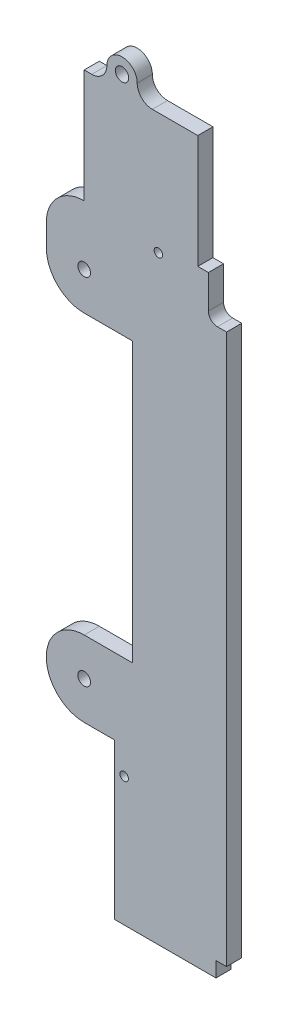
ISO-10303-21;
HEADER;
FILE_DESCRIPTION(('STEP AP214'),'2;1');
FILE_NAME('part.step','',(''),(''),'','','');
FILE_SCHEMA(('AUTOMOTIVE_DESIGN { 1 0 10303 214 1 1 1 1 }'));
ENDSEC;
DATA;
#1=APPLICATION_CONTEXT('core data for automotive mechanical design processes');
#2=APPLICATION_PROTOCOL_DEFINITION('international standard','automotive_design',2000,#1);
#3=PRODUCT_CONTEXT('',#1,'mechanical');
#4=PRODUCT('Part','Part','',(#3));
#5=PRODUCT_RELATED_PRODUCT_CATEGORY('part','',(#4));
#6=PRODUCT_DEFINITION_FORMATION('','',#4);
#7=PRODUCT_DEFINITION_CONTEXT('part definition',#1,'design');
#8=PRODUCT_DEFINITION('design','',#6,#7);
#9=PRODUCT_DEFINITION_SHAPE('','',#8);
#10=(LENGTH_UNIT() NAMED_UNIT(*) SI_UNIT(.MILLI.,.METRE.));
#11=(NAMED_UNIT(*) PLANE_ANGLE_UNIT() SI_UNIT($,.RADIAN.));
#12=(NAMED_UNIT(*) SI_UNIT($,.STERADIAN.) SOLID_ANGLE_UNIT());
#13=UNCERTAINTY_MEASURE_WITH_UNIT(LENGTH_MEASURE(1.E-05),#10,'distance_accuracy_value','');
#14=(GEOMETRIC_REPRESENTATION_CONTEXT(3) GLOBAL_UNCERTAINTY_ASSIGNED_CONTEXT((#13)) GLOBAL_UNIT_ASSIGNED_CONTEXT((#10,
#11,#12)) REPRESENTATION_CONTEXT('',''));
#15=CARTESIAN_POINT('',(0.,0.,0.));
#16=DIRECTION('',(0.,0.,1.));
#17=DIRECTION('',(1.,0.,0.));
#18=AXIS2_PLACEMENT_3D('',#15,#16,#17);
#19=CARTESIAN_POINT('',(44.,125.6,5.));
#20=DIRECTION('',(0.,0.,1.));
#21=DIRECTION('',(1.,0.,0.));
#22=AXIS2_PLACEMENT_3D('',#19,#20,#21);
#23=PLANE('',#22);
#24=CARTESIAN_POINT('',(24.5,134.,5.));
#25=DIRECTION('',(0.,0.,1.));
#26=DIRECTION('',(1.,0.,0.));
#27=AXIS2_PLACEMENT_3D('',#24,#25,#26);
#28=CIRCLE('',#27,1.40000000000001);
#29=CARTESIAN_POINT('',(25.9,134.,5.));
#30=VERTEX_POINT('',#29);
#31=EDGE_CURVE('E447',#30,#30,#28,.T.);
#32=ORIENTED_EDGE('',*,*,#31,.F.);
#33=EDGE_LOOP('',(#32));
#34=FACE_BOUND('',#33,.T.);
#35=CARTESIAN_POINT('',(13.2,-21.3,5.));
#36=DIRECTION('',(0.,0.,1.));
#37=DIRECTION('',(1.,0.,0.));
#38=AXIS2_PLACEMENT_3D('',#35,#36,#37);
#39=CIRCLE('',#38,1.4);
#40=CARTESIAN_POINT('',(14.6,-21.3,5.));
#41=VERTEX_POINT('',#40);
#42=EDGE_CURVE('E449',#41,#41,#39,.T.);
#43=ORIENTED_EDGE('',*,*,#42,.F.);
#44=EDGE_LOOP('',(#43));
#45=FACE_BOUND('',#44,.T.);
#46=CARTESIAN_POINT('',(0.,117.,5.));
#47=DIRECTION('',(0.,0.,1.));
#48=DIRECTION('',(1.,0.,0.));
#49=AXIS2_PLACEMENT_3D('',#46,#47,#48);
#50=CIRCLE('',#49,2.1);
#51=CARTESIAN_POINT('',(2.1,117.,5.));
#52=VERTEX_POINT('',#51);
#53=EDGE_CURVE('E464',#52,#52,#50,.T.);
#54=ORIENTED_EDGE('',*,*,#53,.F.);
#55=EDGE_LOOP('',(#54));
#56=FACE_BOUND('',#55,.T.);
#57=DIRECTION('',(1.,0.,0.));
#58=VECTOR('',#57,1.);
#59=CARTESIAN_POINT('',(43.5,-58.8,5.));
#60=LINE('',#59,#58);
#61=CARTESIAN_POINT('',(43.5,-58.8,5.));
#62=VERTEX_POINT('',#61);
#63=CARTESIAN_POINT('',(47.,-58.8,5.));
#64=VERTEX_POINT('',#63);
#65=EDGE_CURVE('E274',#62,#64,#60,.T.);
#66=ORIENTED_EDGE('',*,*,#65,.T.);
#67=DIRECTION('',(0.,1.,0.));
#68=VECTOR('',#67,1.);
#69=CARTESIAN_POINT('',(47.,-29.8,5.));
#70=LINE('',#69,#68);
#71=CARTESIAN_POINT('',(47.,122.6,5.));
#72=VERTEX_POINT('',#71);
#73=EDGE_CURVE('E142',#64,#72,#70,.T.);
#74=ORIENTED_EDGE('',*,*,#73,.T.);
#75=DIRECTION('',(-1.,0.,0.));
#76=VECTOR('',#75,1.);
#77=CARTESIAN_POINT('',(44.,122.6,5.));
#78=LINE('',#77,#76);
#79=CARTESIAN_POINT('',(44.,122.6,5.));
#80=VERTEX_POINT('',#79);
#81=EDGE_CURVE('E337',#72,#80,#78,.T.);
#82=ORIENTED_EDGE('',*,*,#81,.T.);
#83=CARTESIAN_POINT('',(44.,125.6,5.));
#84=DIRECTION('',(0.,0.,-1.));
#85=DIRECTION('',(1.,0.,0.));
#86=AXIS2_PLACEMENT_3D('',#83,#84,#85);
#87=CIRCLE('',#86,3.);
#88=CARTESIAN_POINT('',(41.,125.6,5.));
#89=VERTEX_POINT('',#88);
#90=EDGE_CURVE('E356',#80,#89,#87,.T.);
#91=ORIENTED_EDGE('',*,*,#90,.T.);
#92=DIRECTION('',(0.,1.,0.));
#93=VECTOR('',#92,1.);
#94=CARTESIAN_POINT('',(41.,136.6,5.));
#95=LINE('',#94,#93);
#96=CARTESIAN_POINT('',(41.,136.6,5.));
#97=VERTEX_POINT('',#96);
#98=EDGE_CURVE('E353',#89,#97,#95,.T.);
#99=ORIENTED_EDGE('',*,*,#98,.T.);
#100=DIRECTION('',(-1.,0.,0.));
#101=VECTOR('',#100,1.);
#102=CARTESIAN_POINT('',(41.,136.6,5.));
#103=LINE('',#102,#101);
#104=CARTESIAN_POINT('',(37.5,136.6,5.));
#105=VERTEX_POINT('',#104);
#106=EDGE_CURVE('E355',#97,#105,#103,.T.);
#107=ORIENTED_EDGE('',*,*,#106,.T.);
#108=DIRECTION('',(0.,1.,0.));
#109=VECTOR('',#108,1.);
#110=CARTESIAN_POINT('',(37.5,136.6,5.));
#111=LINE('',#110,#109);
#112=CARTESIAN_POINT('',(37.5,174.,5.));
#113=VERTEX_POINT('',#112);
#114=EDGE_CURVE('E358',#105,#113,#111,.T.);
#115=ORIENTED_EDGE('',*,*,#114,.T.);
#116=DIRECTION('',(-1.,0.,0.));
#117=VECTOR('',#116,1.);
#118=CARTESIAN_POINT('',(22.5,174.,5.));
#119=LINE('',#118,#117);
#120=CARTESIAN_POINT('',(22.5,174.,5.));
#121=VERTEX_POINT('',#120);
#122=EDGE_CURVE('E364',#113,#121,#119,.T.);
#123=ORIENTED_EDGE('',*,*,#122,.T.);
#124=CARTESIAN_POINT('',(22.5,179.,5.));
#125=DIRECTION('',(0.,0.,-1.));
#126=DIRECTION('',(1.,0.,0.));
#127=AXIS2_PLACEMENT_3D('',#124,#125,#126);
#128=CIRCLE('',#127,4.99999999999998);
#129=CARTESIAN_POINT('',(17.5,179.,5.));
#130=VERTEX_POINT('',#129);
#131=EDGE_CURVE('E366',#121,#130,#128,.T.);
#132=ORIENTED_EDGE('',*,*,#131,.T.);
#133=CARTESIAN_POINT('',(12.5,179.,5.));
#134=DIRECTION('',(0.,0.,1.));
#135=DIRECTION('',(1.,0.,0.));
#136=AXIS2_PLACEMENT_3D('',#133,#134,#135);
#137=CIRCLE('',#136,5.00000000000003);
#138=CARTESIAN_POINT('',(7.49999999999994,179.,5.));
#139=VERTEX_POINT('',#138);
#140=EDGE_CURVE('E368',#130,#139,#137,.T.);
#141=ORIENTED_EDGE('',*,*,#140,.T.);
#142=CARTESIAN_POINT('',(2.49999999999997,179.,5.));
#143=DIRECTION('',(0.,0.,-1.));
#144=DIRECTION('',(1.,0.,0.));
#145=AXIS2_PLACEMENT_3D('',#142,#143,#144);
#146=CIRCLE('',#145,4.99999999999999);
#147=CARTESIAN_POINT('',(2.49999999999997,174.,5.));
#148=VERTEX_POINT('',#147);
#149=EDGE_CURVE('E370',#139,#148,#146,.T.);
#150=ORIENTED_EDGE('',*,*,#149,.T.);
#151=DIRECTION('',(-1.,0.,0.));
#152=VECTOR('',#151,1.);
#153=CARTESIAN_POINT('',(0.,174.,5.));
#154=LINE('',#153,#152);
#155=CARTESIAN_POINT('',(0.,174.,5.));
#156=VERTEX_POINT('',#155);
#157=EDGE_CURVE('E372',#148,#156,#154,.T.);
#158=ORIENTED_EDGE('',*,*,#157,.T.);
#159=DIRECTION('',(0.,-1.,0.));
#160=VECTOR('',#159,1.);
#161=CARTESIAN_POINT('',(0.,136.6,5.));
#162=LINE('',#161,#160);
#163=CARTESIAN_POINT('',(0.,136.6,5.));
#164=VERTEX_POINT('',#163);
#165=EDGE_CURVE('E374',#156,#164,#162,.T.);
#166=ORIENTED_EDGE('',*,*,#165,.T.);
#167=CARTESIAN_POINT('',(0.,124.1,5.));
#168=DIRECTION('',(0.,0.,1.));
#169=DIRECTION('',(1.,0.,0.));
#170=AXIS2_PLACEMENT_3D('',#167,#168,#169);
#171=CIRCLE('',#170,12.5);
#172=CARTESIAN_POINT('',(-12.5,124.1,5.));
#173=VERTEX_POINT('',#172);
#174=EDGE_CURVE('E376',#164,#173,#171,.T.);
#175=ORIENTED_EDGE('',*,*,#174,.T.);
#176=DIRECTION('',(0.,-1.,0.));
#177=VECTOR('',#176,1.);
#178=CARTESIAN_POINT('',(-12.5,124.1,5.));
#179=LINE('',#178,#177);
#180=CARTESIAN_POINT('',(-12.5,117.,5.));
#181=VERTEX_POINT('',#180);
#182=EDGE_CURVE('E378',#173,#181,#179,.T.);
#183=ORIENTED_EDGE('',*,*,#182,.T.);
#184=CARTESIAN_POINT('',(0.,117.,5.));
#185=DIRECTION('',(0.,0.,1.));
#186=DIRECTION('',(1.,0.,0.));
#187=AXIS2_PLACEMENT_3D('',#184,#185,#186);
#188=CIRCLE('',#187,12.5);
#189=CARTESIAN_POINT('',(0.,104.5,5.));
#190=VERTEX_POINT('',#189);
#191=EDGE_CURVE('E380',#181,#190,#188,.T.);
#192=ORIENTED_EDGE('',*,*,#191,.T.);
#193=DIRECTION('',(1.,0.,0.));
#194=VECTOR('',#193,1.);
#195=CARTESIAN_POINT('',(16.,104.5,5.));
#196=LINE('',#195,#194);
#197=CARTESIAN_POINT('',(16.,104.5,5.));
#198=VERTEX_POINT('',#197);
#199=EDGE_CURVE('E382',#190,#198,#196,.T.);
#200=ORIENTED_EDGE('',*,*,#199,.T.);
#201=DIRECTION('',(0.,-1.,0.));
#202=VECTOR('',#201,1.);
#203=CARTESIAN_POINT('',(16.,12.5,5.));
#204=LINE('',#203,#202);
#205=CARTESIAN_POINT('',(16.,12.5,5.));
#206=VERTEX_POINT('',#205);
#207=EDGE_CURVE('E384',#198,#206,#204,.T.);
#208=ORIENTED_EDGE('',*,*,#207,.T.);
#209=DIRECTION('',(-1.,0.,0.));
#210=VECTOR('',#209,1.);
#211=CARTESIAN_POINT('',(0.,12.5,5.));
#212=LINE('',#211,#210);
#213=CARTESIAN_POINT('',(0.,12.5,5.));
#214=VERTEX_POINT('',#213);
#215=EDGE_CURVE('E386',#206,#214,#212,.T.);
#216=ORIENTED_EDGE('',*,*,#215,.T.);
#217=CARTESIAN_POINT('',(0.,0.,5.));
#218=DIRECTION('',(0.,0.,1.));
#219=DIRECTION('',(1.,0.,0.));
#220=AXIS2_PLACEMENT_3D('',#217,#218,#219);
#221=CIRCLE('',#220,12.5);
#222=CARTESIAN_POINT('',(0.,-12.5,5.));
#223=VERTEX_POINT('',#222);
#224=EDGE_CURVE('E388',#214,#223,#221,.T.);
#225=ORIENTED_EDGE('',*,*,#224,.T.);
#226=DIRECTION('',(1.,0.,0.));
#227=VECTOR('',#226,1.);
#228=CARTESIAN_POINT('',(0.,-12.5,5.));
#229=LINE('',#228,#227);
#230=CARTESIAN_POINT('',(10.,-12.5,5.));
#231=VERTEX_POINT('',#230);
#232=EDGE_CURVE('E209',#223,#231,#229,.T.);
#233=ORIENTED_EDGE('',*,*,#232,.T.);
#234=DIRECTION('',(0.,-1.,0.));
#235=VECTOR('',#234,1.);
#236=CARTESIAN_POINT('',(10.,-12.5,5.));
#237=LINE('',#236,#235);
#238=CARTESIAN_POINT('',(10.,-63.8,5.));
#239=VERTEX_POINT('',#238);
#240=EDGE_CURVE('E203',#231,#239,#237,.T.);
#241=ORIENTED_EDGE('',*,*,#240,.T.);
#242=DIRECTION('',(1.,0.,0.));
#243=VECTOR('',#242,1.);
#244=CARTESIAN_POINT('',(43.5,-63.8,5.));
#245=LINE('',#244,#243);
#246=CARTESIAN_POINT('',(43.5,-63.8,5.));
#247=VERTEX_POINT('',#246);
#248=EDGE_CURVE('E207',#239,#247,#245,.T.);
#249=ORIENTED_EDGE('',*,*,#248,.T.);
#250=DIRECTION('',(0.,1.,0.));
#251=VECTOR('',#250,1.);
#252=CARTESIAN_POINT('',(43.5,-58.8,5.));
#253=LINE('',#252,#251);
#254=EDGE_CURVE('E51',#247,#62,#253,.T.);
#255=ORIENTED_EDGE('',*,*,#254,.T.);
#256=EDGE_LOOP('',(#66,#74,#82,#91,#99,#107,#115,#123,#132,#141,#150,#158,#166,#175,#183,#192,
#200,#208,#216,#225,#233,#241,#249,#255));
#257=FACE_BOUND('',#256,.T.);
#258=CARTESIAN_POINT('',(0.,0.,5.));
#259=DIRECTION('',(0.,0.,1.));
#260=DIRECTION('',(1.,0.,0.));
#261=AXIS2_PLACEMENT_3D('',#258,#259,#260);
#262=CIRCLE('',#261,2.1);
#263=CARTESIAN_POINT('',(2.1,0.,5.));
#264=VERTEX_POINT('',#263);
#265=EDGE_CURVE('E230',#264,#264,#262,.T.);
#266=ORIENTED_EDGE('',*,*,#265,.F.);
#267=EDGE_LOOP('',(#266));
#268=FACE_BOUND('',#267,.T.);
#269=CARTESIAN_POINT('',(12.5,179.,5.));
#270=DIRECTION('',(0.,0.,1.));
#271=DIRECTION('',(1.,0.,0.));
#272=AXIS2_PLACEMENT_3D('',#269,#270,#271);
#273=CIRCLE('',#272,2.2);
#274=CARTESIAN_POINT('',(14.7,179.,5.));
#275=VERTEX_POINT('',#274);
#276=EDGE_CURVE('E458',#275,#275,#273,.T.);
#277=ORIENTED_EDGE('',*,*,#276,.F.);
#278=EDGE_LOOP('',(#277));
#279=FACE_BOUND('',#278,.T.);
#280=ADVANCED_FACE('F34',(#34,#45,#56,#257,#268,#279),#23,.T.);
#281=CARTESIAN_POINT('',(44.,125.6,0.));
#282=DIRECTION('',(0.,0.,1.));
#283=DIRECTION('',(1.,0.,0.));
#284=AXIS2_PLACEMENT_3D('',#281,#282,#283);
#285=PLANE('',#284);
#286=CARTESIAN_POINT('',(24.5,134.,0.));
#287=DIRECTION('',(0.,0.,1.));
#288=DIRECTION('',(1.,0.,0.));
#289=AXIS2_PLACEMENT_3D('',#286,#287,#288);
#290=CIRCLE('',#289,1.40000000000001);
#291=CARTESIAN_POINT('',(25.9,134.,0.));
#292=VERTEX_POINT('',#291);
#293=EDGE_CURVE('E445',#292,#292,#290,.T.);
#294=ORIENTED_EDGE('',*,*,#293,.T.);
#295=EDGE_LOOP('',(#294));
#296=FACE_BOUND('',#295,.T.);
#297=CARTESIAN_POINT('',(13.2,-21.3,0.));
#298=DIRECTION('',(0.,0.,1.));
#299=DIRECTION('',(1.,0.,0.));
#300=AXIS2_PLACEMENT_3D('',#297,#298,#299);
#301=CIRCLE('',#300,1.4);
#302=CARTESIAN_POINT('',(14.6,-21.3,0.));
#303=VERTEX_POINT('',#302);
#304=EDGE_CURVE('E452',#303,#303,#301,.T.);
#305=ORIENTED_EDGE('',*,*,#304,.T.);
#306=EDGE_LOOP('',(#305));
#307=FACE_BOUND('',#306,.T.);
#308=CARTESIAN_POINT('',(0.,117.,0.));
#309=DIRECTION('',(0.,0.,1.));
#310=DIRECTION('',(1.,0.,0.));
#311=AXIS2_PLACEMENT_3D('',#308,#309,#310);
#312=CIRCLE('',#311,2.1);
#313=CARTESIAN_POINT('',(2.1,117.,0.));
#314=VERTEX_POINT('',#313);
#315=EDGE_CURVE('E461',#314,#314,#312,.T.);
#316=ORIENTED_EDGE('',*,*,#315,.T.);
#317=EDGE_LOOP('',(#316));
#318=FACE_BOUND('',#317,.T.);
#319=DIRECTION('',(1.,0.,0.));
#320=VECTOR('',#319,1.);
#321=CARTESIAN_POINT('',(43.5,-58.8,0.));
#322=LINE('',#321,#320);
#323=CARTESIAN_POINT('',(43.5,-58.8,0.));
#324=VERTEX_POINT('',#323);
#325=CARTESIAN_POINT('',(47.,-58.8,0.));
#326=VERTEX_POINT('',#325);
#327=EDGE_CURVE('E226',#324,#326,#322,.T.);
#328=ORIENTED_EDGE('',*,*,#327,.F.);
#329=DIRECTION('',(0.,1.,0.));
#330=VECTOR('',#329,1.);
#331=CARTESIAN_POINT('',(43.5,-58.8,0.));
#332=LINE('',#331,#330);
#333=CARTESIAN_POINT('',(43.5,-63.8,0.));
#334=VERTEX_POINT('',#333);
#335=EDGE_CURVE('E134',#334,#324,#332,.T.);
#336=ORIENTED_EDGE('',*,*,#335,.F.);
#337=DIRECTION('',(1.,0.,0.));
#338=VECTOR('',#337,1.);
#339=CARTESIAN_POINT('',(43.5,-63.8,0.));
#340=LINE('',#339,#338);
#341=CARTESIAN_POINT('',(10.,-63.8,0.));
#342=VERTEX_POINT('',#341);
#343=EDGE_CURVE('E128',#342,#334,#340,.T.);
#344=ORIENTED_EDGE('',*,*,#343,.F.);
#345=DIRECTION('',(0.,-1.,0.));
#346=VECTOR('',#345,1.);
#347=CARTESIAN_POINT('',(10.,-63.8,0.));
#348=LINE('',#347,#346);
#349=CARTESIAN_POINT('',(10.,-12.5,0.));
#350=VERTEX_POINT('',#349);
#351=EDGE_CURVE('E216',#350,#342,#348,.T.);
#352=ORIENTED_EDGE('',*,*,#351,.F.);
#353=DIRECTION('',(1.,0.,0.));
#354=VECTOR('',#353,1.);
#355=CARTESIAN_POINT('',(0.,-12.5,0.));
#356=LINE('',#355,#354);
#357=CARTESIAN_POINT('',(0.,-12.5,0.));
#358=VERTEX_POINT('',#357);
#359=EDGE_CURVE('E268',#358,#350,#356,.T.);
#360=ORIENTED_EDGE('',*,*,#359,.F.);
#361=CARTESIAN_POINT('',(0.,0.,0.));
#362=DIRECTION('',(0.,0.,1.));
#363=DIRECTION('',(1.,0.,0.));
#364=AXIS2_PLACEMENT_3D('',#361,#362,#363);
#365=CIRCLE('',#364,12.5);
#366=CARTESIAN_POINT('',(0.,12.5,0.));
#367=VERTEX_POINT('',#366);
#368=EDGE_CURVE('E266',#367,#358,#365,.T.);
#369=ORIENTED_EDGE('',*,*,#368,.F.);
#370=DIRECTION('',(-1.,0.,0.));
#371=VECTOR('',#370,1.);
#372=CARTESIAN_POINT('',(0.,12.5,0.));
#373=LINE('',#372,#371);
#374=CARTESIAN_POINT('',(16.,12.5,0.));
#375=VERTEX_POINT('',#374);
#376=EDGE_CURVE('E264',#375,#367,#373,.T.);
#377=ORIENTED_EDGE('',*,*,#376,.F.);
#378=DIRECTION('',(0.,-1.,0.));
#379=VECTOR('',#378,1.);
#380=CARTESIAN_POINT('',(16.,12.5,0.));
#381=LINE('',#380,#379);
#382=CARTESIAN_POINT('',(16.,104.5,0.));
#383=VERTEX_POINT('',#382);
#384=EDGE_CURVE('E262',#383,#375,#381,.T.);
#385=ORIENTED_EDGE('',*,*,#384,.F.);
#386=DIRECTION('',(1.,0.,0.));
#387=VECTOR('',#386,1.);
#388=CARTESIAN_POINT('',(16.,104.5,0.));
#389=LINE('',#388,#387);
#390=CARTESIAN_POINT('',(0.,104.5,0.));
#391=VERTEX_POINT('',#390);
#392=EDGE_CURVE('E260',#391,#383,#389,.T.);
#393=ORIENTED_EDGE('',*,*,#392,.F.);
#394=CARTESIAN_POINT('',(0.,117.,0.));
#395=DIRECTION('',(0.,0.,1.));
#396=DIRECTION('',(1.,0.,0.));
#397=AXIS2_PLACEMENT_3D('',#394,#395,#396);
#398=CIRCLE('',#397,12.5);
#399=CARTESIAN_POINT('',(-12.5,117.,0.));
#400=VERTEX_POINT('',#399);
#401=EDGE_CURVE('E258',#400,#391,#398,.T.);
#402=ORIENTED_EDGE('',*,*,#401,.F.);
#403=DIRECTION('',(0.,-1.,0.));
#404=VECTOR('',#403,1.);
#405=CARTESIAN_POINT('',(-12.5,124.1,0.));
#406=LINE('',#405,#404);
#407=CARTESIAN_POINT('',(-12.5,124.1,0.));
#408=VERTEX_POINT('',#407);
#409=EDGE_CURVE('E256',#408,#400,#406,.T.);
#410=ORIENTED_EDGE('',*,*,#409,.F.);
#411=CARTESIAN_POINT('',(0.,124.1,0.));
#412=DIRECTION('',(0.,0.,1.));
#413=DIRECTION('',(1.,0.,0.));
#414=AXIS2_PLACEMENT_3D('',#411,#412,#413);
#415=CIRCLE('',#414,12.5);
#416=CARTESIAN_POINT('',(0.,136.6,0.));
#417=VERTEX_POINT('',#416);
#418=EDGE_CURVE('E254',#417,#408,#415,.T.);
#419=ORIENTED_EDGE('',*,*,#418,.F.);
#420=DIRECTION('',(0.,-1.,0.));
#421=VECTOR('',#420,1.);
#422=CARTESIAN_POINT('',(0.,136.6,0.));
#423=LINE('',#422,#421);
#424=CARTESIAN_POINT('',(0.,174.,0.));
#425=VERTEX_POINT('',#424);
#426=EDGE_CURVE('E252',#425,#417,#423,.T.);
#427=ORIENTED_EDGE('',*,*,#426,.F.);
#428=DIRECTION('',(-1.,0.,0.));
#429=VECTOR('',#428,1.);
#430=CARTESIAN_POINT('',(0.,174.,0.));
#431=LINE('',#430,#429);
#432=CARTESIAN_POINT('',(2.49999999999997,174.,0.));
#433=VERTEX_POINT('',#432);
#434=EDGE_CURVE('E250',#433,#425,#431,.T.);
#435=ORIENTED_EDGE('',*,*,#434,.F.);
#436=CARTESIAN_POINT('',(2.49999999999997,179.,0.));
#437=DIRECTION('',(0.,0.,-1.));
#438=DIRECTION('',(1.,0.,0.));
#439=AXIS2_PLACEMENT_3D('',#436,#437,#438);
#440=CIRCLE('',#439,4.99999999999999);
#441=CARTESIAN_POINT('',(7.49999999999994,179.,0.));
#442=VERTEX_POINT('',#441);
#443=EDGE_CURVE('E248',#442,#433,#440,.T.);
#444=ORIENTED_EDGE('',*,*,#443,.F.);
#445=CARTESIAN_POINT('',(12.5,179.,0.));
#446=DIRECTION('',(0.,0.,1.));
#447=DIRECTION('',(1.,0.,0.));
#448=AXIS2_PLACEMENT_3D('',#445,#446,#447);
#449=CIRCLE('',#448,5.00000000000003);
#450=CARTESIAN_POINT('',(17.5,179.,0.));
#451=VERTEX_POINT('',#450);
#452=EDGE_CURVE('E246',#451,#442,#449,.T.);
#453=ORIENTED_EDGE('',*,*,#452,.F.);
#454=CARTESIAN_POINT('',(22.5,179.,0.));
#455=DIRECTION('',(0.,0.,-1.));
#456=DIRECTION('',(1.,0.,0.));
#457=AXIS2_PLACEMENT_3D('',#454,#455,#456);
#458=CIRCLE('',#457,4.99999999999998);
#459=CARTESIAN_POINT('',(22.5,174.,0.));
#460=VERTEX_POINT('',#459);
#461=EDGE_CURVE('E244',#460,#451,#458,.T.);
#462=ORIENTED_EDGE('',*,*,#461,.F.);
#463=DIRECTION('',(-1.,0.,0.));
#464=VECTOR('',#463,1.);
#465=CARTESIAN_POINT('',(22.5,174.,0.));
#466=LINE('',#465,#464);
#467=CARTESIAN_POINT('',(37.5,174.,0.));
#468=VERTEX_POINT('',#467);
#469=EDGE_CURVE('E242',#468,#460,#466,.T.);
#470=ORIENTED_EDGE('',*,*,#469,.F.);
#471=DIRECTION('',(0.,1.,0.));
#472=VECTOR('',#471,1.);
#473=CARTESIAN_POINT('',(37.5,136.6,0.));
#474=LINE('',#473,#472);
#475=CARTESIAN_POINT('',(37.5,136.6,0.));
#476=VERTEX_POINT('',#475);
#477=EDGE_CURVE('E240',#476,#468,#474,.T.);
#478=ORIENTED_EDGE('',*,*,#477,.F.);
#479=DIRECTION('',(-1.,0.,0.));
#480=VECTOR('',#479,1.);
#481=CARTESIAN_POINT('',(41.,136.6,0.));
#482=LINE('',#481,#480);
#483=CARTESIAN_POINT('',(41.,136.6,0.));
#484=VERTEX_POINT('',#483);
#485=EDGE_CURVE('E238',#484,#476,#482,.T.);
#486=ORIENTED_EDGE('',*,*,#485,.F.);
#487=DIRECTION('',(0.,1.,0.));
#488=VECTOR('',#487,1.);
#489=CARTESIAN_POINT('',(41.,136.6,0.));
#490=LINE('',#489,#488);
#491=CARTESIAN_POINT('',(41.,125.6,0.));
#492=VERTEX_POINT('',#491);
#493=EDGE_CURVE('E236',#492,#484,#490,.T.);
#494=ORIENTED_EDGE('',*,*,#493,.F.);
#495=CARTESIAN_POINT('',(44.,125.6,0.));
#496=DIRECTION('',(0.,0.,-1.));
#497=DIRECTION('',(1.,0.,0.));
#498=AXIS2_PLACEMENT_3D('',#495,#496,#497);
#499=CIRCLE('',#498,3.);
#500=CARTESIAN_POINT('',(44.,122.6,0.));
#501=VERTEX_POINT('',#500);
#502=EDGE_CURVE('E234',#501,#492,#499,.T.);
#503=ORIENTED_EDGE('',*,*,#502,.F.);
#504=DIRECTION('',(-1.,0.,0.));
#505=VECTOR('',#504,1.);
#506=CARTESIAN_POINT('',(44.,122.6,0.));
#507=LINE('',#506,#505);
#508=CARTESIAN_POINT('',(47.,122.6,0.));
#509=VERTEX_POINT('',#508);
#510=EDGE_CURVE('E232',#509,#501,#507,.T.);
#511=ORIENTED_EDGE('',*,*,#510,.F.);
#512=DIRECTION('',(0.,1.,0.));
#513=VECTOR('',#512,1.);
#514=CARTESIAN_POINT('',(47.,122.6,0.));
#515=LINE('',#514,#513);
#516=EDGE_CURVE('E229',#326,#509,#515,.T.);
#517=ORIENTED_EDGE('',*,*,#516,.F.);
#518=EDGE_LOOP('',(#328,#336,#344,#352,#360,#369,#377,#385,#393,#402,#410,#419,#427,#435,#444,
#453,#462,#470,#478,#486,#494,#503,#511,#517));
#519=FACE_BOUND('',#518,.T.);
#520=CARTESIAN_POINT('',(0.,0.,0.));
#521=DIRECTION('',(0.,0.,1.));
#522=DIRECTION('',(1.,0.,0.));
#523=AXIS2_PLACEMENT_3D('',#520,#521,#522);
#524=CIRCLE('',#523,2.1);
#525=CARTESIAN_POINT('',(2.1,0.,0.));
#526=VERTEX_POINT('',#525);
#527=EDGE_CURVE('E467',#526,#526,#524,.T.);
#528=ORIENTED_EDGE('',*,*,#527,.T.);
#529=EDGE_LOOP('',(#528));
#530=FACE_BOUND('',#529,.T.);
#531=CARTESIAN_POINT('',(12.5,179.,0.));
#532=DIRECTION('',(0.,0.,1.));
#533=DIRECTION('',(1.,0.,0.));
#534=AXIS2_PLACEMENT_3D('',#531,#532,#533);
#535=CIRCLE('',#534,2.2);
#536=CARTESIAN_POINT('',(14.7,179.,0.));
#537=VERTEX_POINT('',#536);
#538=EDGE_CURVE('E455',#537,#537,#535,.T.);
#539=ORIENTED_EDGE('',*,*,#538,.T.);
#540=EDGE_LOOP('',(#539));
#541=FACE_BOUND('',#540,.T.);
#542=ADVANCED_FACE('F341',(#296,#307,#318,#519,#530,#541),#285,.F.);
#543=CARTESIAN_POINT('',(43.5,-58.8,5.));
#544=DIRECTION('',(0.,1.,0.));
#545=DIRECTION('',(0.,0.,1.));
#546=AXIS2_PLACEMENT_3D('',#543,#544,#545);
#547=PLANE('',#546);
#548=ORIENTED_EDGE('',*,*,#327,.T.);
#549=DIRECTION('',(0.,0.,-1.));
#550=VECTOR('',#549,1.);
#551=CARTESIAN_POINT('',(47.,-58.8,5.));
#552=LINE('',#551,#550);
#553=EDGE_CURVE('E11',#64,#326,#552,.T.);
#554=ORIENTED_EDGE('',*,*,#553,.F.);
#555=ORIENTED_EDGE('',*,*,#65,.F.);
#556=DIRECTION('',(0.,0.,-1.));
#557=VECTOR('',#556,1.);
#558=CARTESIAN_POINT('',(43.5,-58.8,5.));
#559=LINE('',#558,#557);
#560=EDGE_CURVE('E222',#62,#324,#559,.T.);
#561=ORIENTED_EDGE('',*,*,#560,.T.);
#562=EDGE_LOOP('',(#548,#554,#555,#561));
#563=FACE_BOUND('',#562,.T.);
#564=ADVANCED_FACE('F36',(#563),#547,.F.);
#565=CARTESIAN_POINT('',(47.,122.6,5.));
#566=DIRECTION('',(-1.,0.,0.));
#567=DIRECTION('',(0.,-1.,0.));
#568=AXIS2_PLACEMENT_3D('',#565,#566,#567);
#569=PLANE('',#568);
#570=ORIENTED_EDGE('',*,*,#516,.T.);
#571=DIRECTION('',(0.,0.,-1.));
#572=VECTOR('',#571,1.);
#573=CARTESIAN_POINT('',(47.,122.6,5.));
#574=LINE('',#573,#572);
#575=EDGE_CURVE('E43',#72,#509,#574,.T.);
#576=ORIENTED_EDGE('',*,*,#575,.F.);
#577=ORIENTED_EDGE('',*,*,#73,.F.);
#578=ORIENTED_EDGE('',*,*,#553,.T.);
#579=EDGE_LOOP('',(#570,#576,#577,#578));
#580=FACE_BOUND('',#579,.T.);
#581=ADVANCED_FACE('F709',(#580),#569,.F.);
#582=CARTESIAN_POINT('',(44.,122.6,5.));
#583=DIRECTION('',(0.,-1.,0.));
#584=DIRECTION('',(1.,0.,0.));
#585=AXIS2_PLACEMENT_3D('',#582,#583,#584);
#586=PLANE('',#585);
#587=ORIENTED_EDGE('',*,*,#510,.T.);
#588=DIRECTION('',(0.,0.,-1.));
#589=VECTOR('',#588,1.);
#590=CARTESIAN_POINT('',(44.,122.6,5.));
#591=LINE('',#590,#589);
#592=EDGE_CURVE('E329',#80,#501,#591,.T.);
#593=ORIENTED_EDGE('',*,*,#592,.F.);
#594=ORIENTED_EDGE('',*,*,#81,.F.);
#595=ORIENTED_EDGE('',*,*,#575,.T.);
#596=EDGE_LOOP('',(#587,#593,#594,#595));
#597=FACE_BOUND('',#596,.T.);
#598=ADVANCED_FACE('F335',(#597),#586,.F.);
#599=CARTESIAN_POINT('',(44.,125.6,5.));
#600=DIRECTION('',(0.,0.,-1.));
#601=DIRECTION('',(-1.,0.,0.));
#602=AXIS2_PLACEMENT_3D('',#599,#600,#601);
#603=CYLINDRICAL_SURFACE('',#602,3.);
#604=ORIENTED_EDGE('',*,*,#502,.T.);
#605=DIRECTION('',(0.,0.,-1.));
#606=VECTOR('',#605,1.);
#607=CARTESIAN_POINT('',(41.,125.6,5.));
#608=LINE('',#607,#606);
#609=EDGE_CURVE('E326',#89,#492,#608,.T.);
#610=ORIENTED_EDGE('',*,*,#609,.F.);
#611=ORIENTED_EDGE('',*,*,#90,.F.);
#612=ORIENTED_EDGE('',*,*,#592,.T.);
#613=EDGE_LOOP('',(#604,#610,#611,#612));
#614=FACE_BOUND('',#613,.T.);
#615=ADVANCED_FACE('F347',(#614),#603,.F.);
#616=CARTESIAN_POINT('',(41.,136.6,5.));
#617=DIRECTION('',(-1.,0.,0.));
#618=DIRECTION('',(0.,0.,1.));
#619=AXIS2_PLACEMENT_3D('',#616,#617,#618);
#620=PLANE('',#619);
#621=ORIENTED_EDGE('',*,*,#493,.T.);
#622=DIRECTION('',(0.,0.,-1.));
#623=VECTOR('',#622,1.);
#624=CARTESIAN_POINT('',(41.,136.6,5.));
#625=LINE('',#624,#623);
#626=EDGE_CURVE('E323',#97,#484,#625,.T.);
#627=ORIENTED_EDGE('',*,*,#626,.F.);
#628=ORIENTED_EDGE('',*,*,#98,.F.);
#629=ORIENTED_EDGE('',*,*,#609,.T.);
#630=EDGE_LOOP('',(#621,#627,#628,#629));
#631=FACE_BOUND('',#630,.T.);
#632=ADVANCED_FACE('F351',(#631),#620,.F.);
#633=CARTESIAN_POINT('',(41.,136.6,5.));
#634=DIRECTION('',(0.,-1.,0.));
#635=DIRECTION('',(1.,0.,0.));
#636=AXIS2_PLACEMENT_3D('',#633,#634,#635);
#637=PLANE('',#636);
#638=ORIENTED_EDGE('',*,*,#485,.T.);
#639=DIRECTION('',(0.,0.,-1.));
#640=VECTOR('',#639,1.);
#641=CARTESIAN_POINT('',(37.5,136.6,5.));
#642=LINE('',#641,#640);
#643=EDGE_CURVE('E320',#105,#476,#642,.T.);
#644=ORIENTED_EDGE('',*,*,#643,.F.);
#645=ORIENTED_EDGE('',*,*,#106,.F.);
#646=ORIENTED_EDGE('',*,*,#626,.T.);
#647=EDGE_LOOP('',(#638,#644,#645,#646));
#648=FACE_BOUND('',#647,.T.);
#649=ADVANCED_FACE('F674',(#648),#637,.F.);
#650=CARTESIAN_POINT('',(37.5,136.6,5.));
#651=DIRECTION('',(-1.,0.,0.));
#652=DIRECTION('',(0.,0.,1.));
#653=AXIS2_PLACEMENT_3D('',#650,#651,#652);
#654=PLANE('',#653);
#655=ORIENTED_EDGE('',*,*,#477,.T.);
#656=DIRECTION('',(0.,0.,-1.));
#657=VECTOR('',#656,1.);
#658=CARTESIAN_POINT('',(37.5,174.,5.));
#659=LINE('',#658,#657);
#660=EDGE_CURVE('E317',#113,#468,#659,.T.);
#661=ORIENTED_EDGE('',*,*,#660,.F.);
#662=ORIENTED_EDGE('',*,*,#114,.F.);
#663=ORIENTED_EDGE('',*,*,#643,.T.);
#664=EDGE_LOOP('',(#655,#661,#662,#663));
#665=FACE_BOUND('',#664,.T.);
#666=ADVANCED_FACE('F664',(#665),#654,.F.);
#667=CARTESIAN_POINT('',(22.5,174.,5.));
#668=DIRECTION('',(0.,-1.,0.));
#669=DIRECTION('',(0.,0.,-1.));
#670=AXIS2_PLACEMENT_3D('',#667,#668,#669);
#671=PLANE('',#670);
#672=ORIENTED_EDGE('',*,*,#469,.T.);
#673=DIRECTION('',(0.,0.,-1.));
#674=VECTOR('',#673,1.);
#675=CARTESIAN_POINT('',(22.5,174.,5.));
#676=LINE('',#675,#674);
#677=EDGE_CURVE('E314',#121,#460,#676,.T.);
#678=ORIENTED_EDGE('',*,*,#677,.F.);
#679=ORIENTED_EDGE('',*,*,#122,.F.);
#680=ORIENTED_EDGE('',*,*,#660,.T.);
#681=EDGE_LOOP('',(#672,#678,#679,#680));
#682=FACE_BOUND('',#681,.T.);
#683=ADVANCED_FACE('F654',(#682),#671,.F.);
#684=CARTESIAN_POINT('',(22.5,179.,5.));
#685=DIRECTION('',(0.,0.,-1.));
#686=DIRECTION('',(-1.,0.,0.));
#687=AXIS2_PLACEMENT_3D('',#684,#685,#686);
#688=CYLINDRICAL_SURFACE('',#687,4.99999999999998);
#689=ORIENTED_EDGE('',*,*,#461,.T.);
#690=DIRECTION('',(0.,0.,-1.));
#691=VECTOR('',#690,1.);
#692=CARTESIAN_POINT('',(17.5,179.,5.));
#693=LINE('',#692,#691);
#694=EDGE_CURVE('E311',#130,#451,#693,.T.);
#695=ORIENTED_EDGE('',*,*,#694,.F.);
#696=ORIENTED_EDGE('',*,*,#131,.F.);
#697=ORIENTED_EDGE('',*,*,#677,.T.);
#698=EDGE_LOOP('',(#689,#695,#696,#697));
#699=FACE_BOUND('',#698,.T.);
#700=ADVANCED_FACE('F644',(#699),#688,.F.);
#701=CARTESIAN_POINT('',(12.5,179.,5.));
#702=DIRECTION('',(0.,0.,-1.));
#703=DIRECTION('',(-1.,0.,0.));
#704=AXIS2_PLACEMENT_3D('',#701,#702,#703);
#705=CYLINDRICAL_SURFACE('',#704,5.00000000000003);
#706=ORIENTED_EDGE('',*,*,#452,.T.);
#707=DIRECTION('',(0.,0.,-1.));
#708=VECTOR('',#707,1.);
#709=CARTESIAN_POINT('',(7.49999999999994,179.,5.));
#710=LINE('',#709,#708);
#711=EDGE_CURVE('E308',#139,#442,#710,.T.);
#712=ORIENTED_EDGE('',*,*,#711,.F.);
#713=ORIENTED_EDGE('',*,*,#140,.F.);
#714=ORIENTED_EDGE('',*,*,#694,.T.);
#715=EDGE_LOOP('',(#706,#712,#713,#714));
#716=FACE_BOUND('',#715,.T.);
#717=ADVANCED_FACE('F634',(#716),#705,.T.);
#718=CARTESIAN_POINT('',(2.49999999999997,179.,5.));
#719=DIRECTION('',(0.,0.,-1.));
#720=DIRECTION('',(-1.,0.,0.));
#721=AXIS2_PLACEMENT_3D('',#718,#719,#720);
#722=CYLINDRICAL_SURFACE('',#721,4.99999999999999);
#723=ORIENTED_EDGE('',*,*,#443,.T.);
#724=DIRECTION('',(0.,0.,-1.));
#725=VECTOR('',#724,1.);
#726=CARTESIAN_POINT('',(2.49999999999997,174.,5.));
#727=LINE('',#726,#725);
#728=EDGE_CURVE('E305',#148,#433,#727,.T.);
#729=ORIENTED_EDGE('',*,*,#728,.F.);
#730=ORIENTED_EDGE('',*,*,#149,.F.);
#731=ORIENTED_EDGE('',*,*,#711,.T.);
#732=EDGE_LOOP('',(#723,#729,#730,#731));
#733=FACE_BOUND('',#732,.T.);
#734=ADVANCED_FACE('F624',(#733),#722,.F.);
#735=CARTESIAN_POINT('',(0.,174.,5.));
#736=DIRECTION('',(0.,-1.,0.));
#737=DIRECTION('',(0.,0.,-1.));
#738=AXIS2_PLACEMENT_3D('',#735,#736,#737);
#739=PLANE('',#738);
#740=ORIENTED_EDGE('',*,*,#434,.T.);
#741=DIRECTION('',(0.,0.,-1.));
#742=VECTOR('',#741,1.);
#743=CARTESIAN_POINT('',(0.,174.,5.));
#744=LINE('',#743,#742);
#745=EDGE_CURVE('E302',#156,#425,#744,.T.);
#746=ORIENTED_EDGE('',*,*,#745,.F.);
#747=ORIENTED_EDGE('',*,*,#157,.F.);
#748=ORIENTED_EDGE('',*,*,#728,.T.);
#749=EDGE_LOOP('',(#740,#746,#747,#748));
#750=FACE_BOUND('',#749,.T.);
#751=ADVANCED_FACE('F614',(#750),#739,.F.);
#752=CARTESIAN_POINT('',(0.,136.6,5.));
#753=DIRECTION('',(1.,0.,0.));
#754=DIRECTION('',(0.,0.,-1.));
#755=AXIS2_PLACEMENT_3D('',#752,#753,#754);
#756=PLANE('',#755);
#757=ORIENTED_EDGE('',*,*,#426,.T.);
#758=DIRECTION('',(0.,0.,-1.));
#759=VECTOR('',#758,1.);
#760=CARTESIAN_POINT('',(0.,136.6,5.));
#761=LINE('',#760,#759);
#762=EDGE_CURVE('E299',#164,#417,#761,.T.);
#763=ORIENTED_EDGE('',*,*,#762,.F.);
#764=ORIENTED_EDGE('',*,*,#165,.F.);
#765=ORIENTED_EDGE('',*,*,#745,.T.);
#766=EDGE_LOOP('',(#757,#763,#764,#765));
#767=FACE_BOUND('',#766,.T.);
#768=ADVANCED_FACE('F604',(#767),#756,.F.);
#769=CARTESIAN_POINT('',(0.,124.1,5.));
#770=DIRECTION('',(0.,0.,-1.));
#771=DIRECTION('',(-1.,0.,0.));
#772=AXIS2_PLACEMENT_3D('',#769,#770,#771);
#773=CYLINDRICAL_SURFACE('',#772,12.5);
#774=ORIENTED_EDGE('',*,*,#418,.T.);
#775=DIRECTION('',(0.,0.,-1.));
#776=VECTOR('',#775,1.);
#777=CARTESIAN_POINT('',(-12.5,124.1,5.));
#778=LINE('',#777,#776);
#779=EDGE_CURVE('E296',#173,#408,#778,.T.);
#780=ORIENTED_EDGE('',*,*,#779,.F.);
#781=ORIENTED_EDGE('',*,*,#174,.F.);
#782=ORIENTED_EDGE('',*,*,#762,.T.);
#783=EDGE_LOOP('',(#774,#780,#781,#782));
#784=FACE_BOUND('',#783,.T.);
#785=ADVANCED_FACE('F594',(#784),#773,.T.);
#786=CARTESIAN_POINT('',(-12.5,124.1,5.));
#787=DIRECTION('',(1.,0.,0.));
#788=DIRECTION('',(0.,1.,0.));
#789=AXIS2_PLACEMENT_3D('',#786,#787,#788);
#790=PLANE('',#789);
#791=ORIENTED_EDGE('',*,*,#409,.T.);
#792=DIRECTION('',(0.,0.,-1.));
#793=VECTOR('',#792,1.);
#794=CARTESIAN_POINT('',(-12.5,117.,5.));
#795=LINE('',#794,#793);
#796=EDGE_CURVE('E293',#181,#400,#795,.T.);
#797=ORIENTED_EDGE('',*,*,#796,.F.);
#798=ORIENTED_EDGE('',*,*,#182,.F.);
#799=ORIENTED_EDGE('',*,*,#779,.T.);
#800=EDGE_LOOP('',(#791,#797,#798,#799));
#801=FACE_BOUND('',#800,.T.);
#802=ADVANCED_FACE('F584',(#801),#790,.F.);
#803=CARTESIAN_POINT('',(0.,117.,5.));
#804=DIRECTION('',(0.,0.,-1.));
#805=DIRECTION('',(-1.,0.,0.));
#806=AXIS2_PLACEMENT_3D('',#803,#804,#805);
#807=CYLINDRICAL_SURFACE('',#806,12.5);
#808=ORIENTED_EDGE('',*,*,#401,.T.);
#809=DIRECTION('',(0.,0.,-1.));
#810=VECTOR('',#809,1.);
#811=CARTESIAN_POINT('',(0.,104.5,5.));
#812=LINE('',#811,#810);
#813=EDGE_CURVE('E290',#190,#391,#812,.T.);
#814=ORIENTED_EDGE('',*,*,#813,.F.);
#815=ORIENTED_EDGE('',*,*,#191,.F.);
#816=ORIENTED_EDGE('',*,*,#796,.T.);
#817=EDGE_LOOP('',(#808,#814,#815,#816));
#818=FACE_BOUND('',#817,.T.);
#819=ADVANCED_FACE('F574',(#818),#807,.T.);
#820=CARTESIAN_POINT('',(16.,104.5,5.));
#821=DIRECTION('',(0.,1.,0.));
#822=DIRECTION('',(-1.,0.,0.));
#823=AXIS2_PLACEMENT_3D('',#820,#821,#822);
#824=PLANE('',#823);
#825=ORIENTED_EDGE('',*,*,#392,.T.);
#826=DIRECTION('',(0.,0.,-1.));
#827=VECTOR('',#826,1.);
#828=CARTESIAN_POINT('',(16.,104.5,5.));
#829=LINE('',#828,#827);
#830=EDGE_CURVE('E287',#198,#383,#829,.T.);
#831=ORIENTED_EDGE('',*,*,#830,.F.);
#832=ORIENTED_EDGE('',*,*,#199,.F.);
#833=ORIENTED_EDGE('',*,*,#813,.T.);
#834=EDGE_LOOP('',(#825,#831,#832,#833));
#835=FACE_BOUND('',#834,.T.);
#836=ADVANCED_FACE('F564',(#835),#824,.F.);
#837=CARTESIAN_POINT('',(16.,12.5,5.));
#838=DIRECTION('',(1.,0.,0.));
#839=DIRECTION('',(0.,0.,-1.));
#840=AXIS2_PLACEMENT_3D('',#837,#838,#839);
#841=PLANE('',#840);
#842=ORIENTED_EDGE('',*,*,#384,.T.);
#843=DIRECTION('',(0.,0.,-1.));
#844=VECTOR('',#843,1.);
#845=CARTESIAN_POINT('',(16.,12.5,5.));
#846=LINE('',#845,#844);
#847=EDGE_CURVE('E284',#206,#375,#846,.T.);
#848=ORIENTED_EDGE('',*,*,#847,.F.);
#849=ORIENTED_EDGE('',*,*,#207,.F.);
#850=ORIENTED_EDGE('',*,*,#830,.T.);
#851=EDGE_LOOP('',(#842,#848,#849,#850));
#852=FACE_BOUND('',#851,.T.);
#853=ADVANCED_FACE('F554',(#852),#841,.F.);
#854=CARTESIAN_POINT('',(0.,12.5,5.));
#855=DIRECTION('',(0.,-1.,0.));
#856=DIRECTION('',(1.,0.,0.));
#857=AXIS2_PLACEMENT_3D('',#854,#855,#856);
#858=PLANE('',#857);
#859=ORIENTED_EDGE('',*,*,#376,.T.);
#860=DIRECTION('',(0.,0.,-1.));
#861=VECTOR('',#860,1.);
#862=CARTESIAN_POINT('',(0.,12.5,5.));
#863=LINE('',#862,#861);
#864=EDGE_CURVE('E281',#214,#367,#863,.T.);
#865=ORIENTED_EDGE('',*,*,#864,.F.);
#866=ORIENTED_EDGE('',*,*,#215,.F.);
#867=ORIENTED_EDGE('',*,*,#847,.T.);
#868=EDGE_LOOP('',(#859,#865,#866,#867));
#869=FACE_BOUND('',#868,.T.);
#870=ADVANCED_FACE('F545',(#869),#858,.F.);
#871=CARTESIAN_POINT('',(0.,0.,5.));
#872=DIRECTION('',(0.,0.,-1.));
#873=DIRECTION('',(-1.,0.,0.));
#874=AXIS2_PLACEMENT_3D('',#871,#872,#873);
#875=CYLINDRICAL_SURFACE('',#874,12.5);
#876=ORIENTED_EDGE('',*,*,#368,.T.);
#877=DIRECTION('',(0.,0.,-1.));
#878=VECTOR('',#877,1.);
#879=CARTESIAN_POINT('',(0.,-12.5,5.));
#880=LINE('',#879,#878);
#881=EDGE_CURVE('E278',#223,#358,#880,.T.);
#882=ORIENTED_EDGE('',*,*,#881,.F.);
#883=ORIENTED_EDGE('',*,*,#224,.F.);
#884=ORIENTED_EDGE('',*,*,#864,.T.);
#885=EDGE_LOOP('',(#876,#882,#883,#884));
#886=FACE_BOUND('',#885,.T.);
#887=ADVANCED_FACE('F394',(#886),#875,.T.);
#888=CARTESIAN_POINT('',(0.,-12.5,5.));
#889=DIRECTION('',(0.,1.,0.));
#890=DIRECTION('',(-1.,0.,0.));
#891=AXIS2_PLACEMENT_3D('',#888,#889,#890);
#892=PLANE('',#891);
#893=ORIENTED_EDGE('',*,*,#359,.T.);
#894=DIRECTION('',(0.,0.,-1.));
#895=VECTOR('',#894,1.);
#896=CARTESIAN_POINT('',(10.,-12.5,5.));
#897=LINE('',#896,#895);
#898=EDGE_CURVE('E217',#231,#350,#897,.T.);
#899=ORIENTED_EDGE('',*,*,#898,.F.);
#900=ORIENTED_EDGE('',*,*,#232,.F.);
#901=ORIENTED_EDGE('',*,*,#881,.T.);
#902=EDGE_LOOP('',(#893,#899,#900,#901));
#903=FACE_BOUND('',#902,.T.);
#904=ADVANCED_FACE('F398',(#903),#892,.F.);
#905=CARTESIAN_POINT('',(10.,-63.8,5.));
#906=DIRECTION('',(1.,0.,0.));
#907=DIRECTION('',(0.,1.,0.));
#908=AXIS2_PLACEMENT_3D('',#905,#906,#907);
#909=PLANE('',#908);
#910=ORIENTED_EDGE('',*,*,#351,.T.);
#911=DIRECTION('',(0.,0.,-1.));
#912=VECTOR('',#911,1.);
#913=CARTESIAN_POINT('',(10.,-63.8,5.));
#914=LINE('',#913,#912);
#915=EDGE_CURVE('E214',#239,#342,#914,.T.);
#916=ORIENTED_EDGE('',*,*,#915,.F.);
#917=ORIENTED_EDGE('',*,*,#240,.F.);
#918=ORIENTED_EDGE('',*,*,#898,.T.);
#919=EDGE_LOOP('',(#910,#916,#917,#918));
#920=FACE_BOUND('',#919,.T.);
#921=ADVANCED_FACE('F215',(#920),#909,.F.);
#922=CARTESIAN_POINT('',(43.5,-63.8,5.));
#923=DIRECTION('',(0.,1.,0.));
#924=DIRECTION('',(0.,0.,1.));
#925=AXIS2_PLACEMENT_3D('',#922,#923,#924);
#926=PLANE('',#925);
#927=ORIENTED_EDGE('',*,*,#343,.T.);
#928=DIRECTION('',(0.,0.,-1.));
#929=VECTOR('',#928,1.);
#930=CARTESIAN_POINT('',(43.5,-63.8,5.));
#931=LINE('',#930,#929);
#932=EDGE_CURVE('E218',#247,#334,#931,.T.);
#933=ORIENTED_EDGE('',*,*,#932,.F.);
#934=ORIENTED_EDGE('',*,*,#248,.F.);
#935=ORIENTED_EDGE('',*,*,#915,.T.);
#936=EDGE_LOOP('',(#927,#933,#934,#935));
#937=FACE_BOUND('',#936,.T.);
#938=ADVANCED_FACE('F220',(#937),#926,.F.);
#939=CARTESIAN_POINT('',(43.5,-58.8,5.));
#940=DIRECTION('',(-1.,0.,0.));
#941=DIRECTION('',(0.,0.,1.));
#942=AXIS2_PLACEMENT_3D('',#939,#940,#941);
#943=PLANE('',#942);
#944=ORIENTED_EDGE('',*,*,#335,.T.);
#945=ORIENTED_EDGE('',*,*,#560,.F.);
#946=ORIENTED_EDGE('',*,*,#254,.F.);
#947=ORIENTED_EDGE('',*,*,#932,.T.);
#948=EDGE_LOOP('',(#944,#945,#946,#947));
#949=FACE_BOUND('',#948,.T.);
#950=ADVANCED_FACE('F403',(#949),#943,.F.);
#951=CARTESIAN_POINT('',(0.,0.,5.));
#952=DIRECTION('',(0.,0.,-1.));
#953=DIRECTION('',(-1.,0.,0.));
#954=AXIS2_PLACEMENT_3D('',#951,#952,#953);
#955=CYLINDRICAL_SURFACE('',#954,2.1);
#956=ORIENTED_EDGE('',*,*,#265,.T.);
#957=EDGE_LOOP('',(#956));
#958=FACE_BOUND('',#957,.T.);
#959=ORIENTED_EDGE('',*,*,#527,.F.);
#960=EDGE_LOOP('',(#959));
#961=FACE_BOUND('',#960,.T.);
#962=ADVANCED_FACE('F405',(#958,#961),#955,.F.);
#963=CARTESIAN_POINT('',(0.,117.,5.));
#964=DIRECTION('',(0.,0.,-1.));
#965=DIRECTION('',(-1.,0.,0.));
#966=AXIS2_PLACEMENT_3D('',#963,#964,#965);
#967=CYLINDRICAL_SURFACE('',#966,2.1);
#968=ORIENTED_EDGE('',*,*,#53,.T.);
#969=EDGE_LOOP('',(#968));
#970=FACE_BOUND('',#969,.T.);
#971=ORIENTED_EDGE('',*,*,#315,.F.);
#972=EDGE_LOOP('',(#971));
#973=FACE_BOUND('',#972,.T.);
#974=ADVANCED_FACE('F411',(#970,#973),#967,.F.);
#975=CARTESIAN_POINT('',(12.5,179.,5.));
#976=DIRECTION('',(0.,0.,-1.));
#977=DIRECTION('',(-1.,0.,0.));
#978=AXIS2_PLACEMENT_3D('',#975,#976,#977);
#979=CYLINDRICAL_SURFACE('',#978,2.2);
#980=ORIENTED_EDGE('',*,*,#276,.T.);
#981=EDGE_LOOP('',(#980));
#982=FACE_BOUND('',#981,.T.);
#983=ORIENTED_EDGE('',*,*,#538,.F.);
#984=EDGE_LOOP('',(#983));
#985=FACE_BOUND('',#984,.T.);
#986=ADVANCED_FACE('F428',(#982,#985),#979,.F.);
#987=CARTESIAN_POINT('',(13.2,-21.3,0.));
#988=DIRECTION('',(0.,0.,1.));
#989=DIRECTION('',(1.,0.,0.));
#990=AXIS2_PLACEMENT_3D('',#987,#988,#989);
#991=CYLINDRICAL_SURFACE('',#990,1.4);
#992=ORIENTED_EDGE('',*,*,#304,.F.);
#993=EDGE_LOOP('',(#992));
#994=FACE_BOUND('',#993,.T.);
#995=ORIENTED_EDGE('',*,*,#42,.T.);
#996=EDGE_LOOP('',(#995));
#997=FACE_BOUND('',#996,.T.);
#998=ADVANCED_FACE('F432',(#994,#997),#991,.F.);
#999=CARTESIAN_POINT('',(24.5,134.,0.));
#1000=DIRECTION('',(0.,0.,1.));
#1001=DIRECTION('',(1.,0.,0.));
#1002=AXIS2_PLACEMENT_3D('',#999,#1000,#1001);
#1003=CYLINDRICAL_SURFACE('',#1002,1.40000000000001);
#1004=ORIENTED_EDGE('',*,*,#293,.F.);
#1005=EDGE_LOOP('',(#1004));
#1006=FACE_BOUND('',#1005,.T.);
#1007=ORIENTED_EDGE('',*,*,#31,.T.);
#1008=EDGE_LOOP('',(#1007));
#1009=FACE_BOUND('',#1008,.T.);
#1010=ADVANCED_FACE('F436',(#1006,#1009),#1003,.F.);
#1011=CLOSED_SHELL('',(#280,#542,#564,#581,#598,#615,#632,#649,#666,#683,#700,#717,#734,#751,
#768,#785,#802,#819,#836,#853,#870,#887,#904,#921,#938,#950,#962,#974,#986,#998,#1010));
#1012=MANIFOLD_SOLID_BREP('B2',#1011);
#1013=ADVANCED_BREP_SHAPE_REPRESENTATION('',(#18,#1012),#14);
#1014=SHAPE_DEFINITION_REPRESENTATION(#9,#1013);
ENDSEC;
END-ISO-10303-21;
